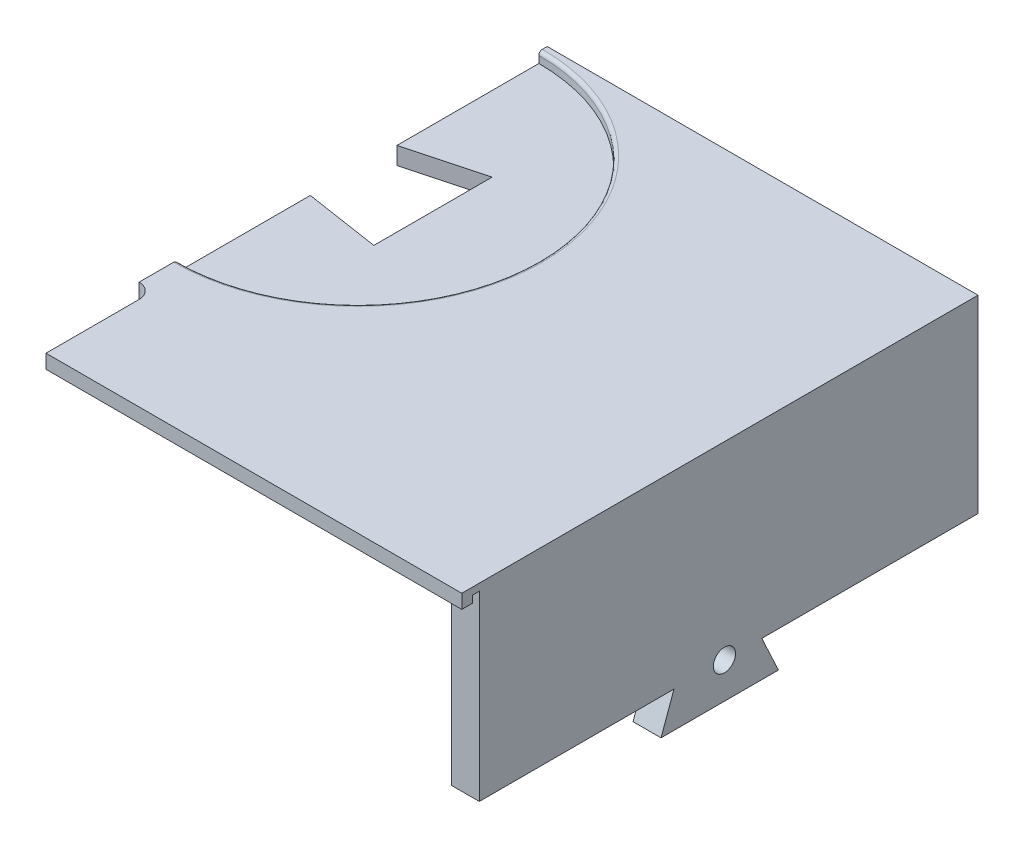
ISO-10303-21;
HEADER;
FILE_DESCRIPTION(('STEP AP214'),'2;1');
FILE_NAME('part.step','',(''),(''),'','','');
FILE_SCHEMA(('AUTOMOTIVE_DESIGN { 1 0 10303 214 1 1 1 1 }'));
ENDSEC;
DATA;
#1=APPLICATION_CONTEXT('core data for automotive mechanical design processes');
#2=APPLICATION_PROTOCOL_DEFINITION('international standard','automotive_design',2000,#1);
#3=PRODUCT_CONTEXT('',#1,'mechanical');
#4=PRODUCT('Part','Part','',(#3));
#5=PRODUCT_RELATED_PRODUCT_CATEGORY('part','',(#4));
#6=PRODUCT_DEFINITION_FORMATION('','',#4);
#7=PRODUCT_DEFINITION_CONTEXT('part definition',#1,'design');
#8=PRODUCT_DEFINITION('design','',#6,#7);
#9=PRODUCT_DEFINITION_SHAPE('','',#8);
#10=(LENGTH_UNIT() NAMED_UNIT(*) SI_UNIT(.MILLI.,.METRE.));
#11=(NAMED_UNIT(*) PLANE_ANGLE_UNIT() SI_UNIT($,.RADIAN.));
#12=(NAMED_UNIT(*) SI_UNIT($,.STERADIAN.) SOLID_ANGLE_UNIT());
#13=UNCERTAINTY_MEASURE_WITH_UNIT(LENGTH_MEASURE(1.E-05),#10,'distance_accuracy_value','');
#14=(GEOMETRIC_REPRESENTATION_CONTEXT(3) GLOBAL_UNCERTAINTY_ASSIGNED_CONTEXT((#13)) GLOBAL_UNIT_ASSIGNED_CONTEXT((#10,
#11,#12)) REPRESENTATION_CONTEXT('',''));
#15=CARTESIAN_POINT('',(0.,0.,0.));
#16=DIRECTION('',(0.,0.,1.));
#17=DIRECTION('',(1.,0.,0.));
#18=AXIS2_PLACEMENT_3D('',#15,#16,#17);
#19=CARTESIAN_POINT('',(-0.0100000000001627,-46.,90.919595482007));
#20=DIRECTION('',(0.,-1.,0.));
#21=DIRECTION('',(0.,0.,-1.));
#22=AXIS2_PLACEMENT_3D('',#19,#20,#21);
#23=PLANE('',#22);
#24=DIRECTION('',(0.,0.,1.));
#25=VECTOR('',#24,1.);
#26=CARTESIAN_POINT('',(115.,-46.,0.));
#27=LINE('',#26,#25);
#28=CARTESIAN_POINT('',(115.,-46.,14.4113737851326));
#29=VERTEX_POINT('',#28);
#30=CARTESIAN_POINT('',(115.,-46.,70.));
#31=VERTEX_POINT('',#30);
#32=EDGE_CURVE('E442',#29,#31,#27,.T.);
#33=ORIENTED_EDGE('',*,*,#32,.F.);
#34=DIRECTION('',(1.,0.,0.));
#35=VECTOR('',#34,1.);
#36=CARTESIAN_POINT('',(-0.0100000000001627,-46.,14.4113737851326));
#37=LINE('',#36,#35);
#38=CARTESIAN_POINT('',(123.,-46.,14.4113737851326));
#39=VERTEX_POINT('',#38);
#40=EDGE_CURVE('E11',#29,#39,#37,.T.);
#41=ORIENTED_EDGE('',*,*,#40,.T.);
#42=DIRECTION('',(0.,0.,1.));
#43=VECTOR('',#42,1.);
#44=CARTESIAN_POINT('',(123.,-46.,-313.));
#45=LINE('',#44,#43);
#46=CARTESIAN_POINT('',(123.,-46.,70.));
#47=VERTEX_POINT('',#46);
#48=EDGE_CURVE('E259',#39,#47,#45,.T.);
#49=ORIENTED_EDGE('',*,*,#48,.T.);
#50=DIRECTION('',(-1.,0.,0.));
#51=VECTOR('',#50,1.);
#52=CARTESIAN_POINT('',(123.,-46.,70.));
#53=LINE('',#52,#51);
#54=EDGE_CURVE('E251',#47,#31,#53,.T.);
#55=ORIENTED_EDGE('',*,*,#54,.T.);
#56=EDGE_LOOP('',(#33,#41,#49,#55));
#57=FACE_BOUND('',#56,.T.);
#58=ADVANCED_FACE('F34',(#57),#23,.T.);
#59=CARTESIAN_POINT('',(-0.0100000000001627,-46.,14.4113737851326));
#60=DIRECTION('',(0.,0.340441083604863,0.940265849956249));
#61=DIRECTION('',(0.,-0.940265849956249,0.340441083604863));
#62=AXIS2_PLACEMENT_3D('',#59,#60,#61);
#63=PLANE('',#62);
#64=DIRECTION('',(0.,0.940265849956249,-0.340441083604863));
#65=VECTOR('',#64,1.);
#66=CARTESIAN_POINT('',(115.,-0.718251440133874,-1.98374207275064));
#67=LINE('',#66,#65);
#68=CARTESIAN_POINT('',(115.,-56.2075124770156,18.1071972681901));
#69=VERTEX_POINT('',#68);
#70=EDGE_CURVE('E445',#69,#29,#67,.T.);
#71=ORIENTED_EDGE('',*,*,#70,.F.);
#72=DIRECTION('',(1.,0.,0.));
#73=VECTOR('',#72,1.);
#74=CARTESIAN_POINT('',(-0.0100000000001627,-56.2075124770156,18.1071972681901));
#75=LINE('',#74,#73);
#76=CARTESIAN_POINT('',(123.,-56.2075124770156,18.1071972681901));
#77=VERTEX_POINT('',#76);
#78=EDGE_CURVE('E43',#69,#77,#75,.T.);
#79=ORIENTED_EDGE('',*,*,#78,.T.);
#80=DIRECTION('',(0.,0.940265849956249,-0.340441083604863));
#81=VECTOR('',#80,1.);
#82=CARTESIAN_POINT('',(123.,106.547451582208,-40.8213242015313));
#83=LINE('',#82,#81);
#84=EDGE_CURVE('E262',#77,#39,#83,.T.);
#85=ORIENTED_EDGE('',*,*,#84,.T.);
#86=ORIENTED_EDGE('',*,*,#40,.F.);
#87=EDGE_LOOP('',(#71,#79,#85,#86));
#88=FACE_BOUND('',#87,.T.);
#89=ADVANCED_FACE('F469',(#88),#63,.T.);
#90=CARTESIAN_POINT('',(-0.0100000000001627,-56.2075124770156,18.1071972681901));
#91=DIRECTION('',(0.,-1.,0.));
#92=DIRECTION('',(0.,0.,-1.));
#93=AXIS2_PLACEMENT_3D('',#90,#91,#92);
#94=PLANE('',#93);
#95=DIRECTION('',(0.,0.,1.));
#96=VECTOR('',#95,1.);
#97=CARTESIAN_POINT('',(115.,-56.2075124770156,0.));
#98=LINE('',#97,#96);
#99=CARTESIAN_POINT('',(115.,-56.2075124770156,-15.4192014709746));
#100=VERTEX_POINT('',#99);
#101=EDGE_CURVE('E448',#100,#69,#98,.T.);
#102=ORIENTED_EDGE('',*,*,#101,.F.);
#103=DIRECTION('',(1.,0.,0.));
#104=VECTOR('',#103,1.);
#105=CARTESIAN_POINT('',(-0.0100000000001627,-56.2075124770156,-15.4192014709746));
#106=LINE('',#105,#104);
#107=CARTESIAN_POINT('',(123.,-56.2075124770156,-15.4192014709746));
#108=VERTEX_POINT('',#107);
#109=EDGE_CURVE('E438',#100,#108,#106,.T.);
#110=ORIENTED_EDGE('',*,*,#109,.T.);
#111=DIRECTION('',(0.,0.,1.));
#112=VECTOR('',#111,1.);
#113=CARTESIAN_POINT('',(123.,-56.2075124770156,-313.));
#114=LINE('',#113,#112);
#115=EDGE_CURVE('E463',#108,#77,#114,.T.);
#116=ORIENTED_EDGE('',*,*,#115,.T.);
#117=ORIENTED_EDGE('',*,*,#78,.F.);
#118=EDGE_LOOP('',(#102,#110,#116,#117));
#119=FACE_BOUND('',#118,.T.);
#120=ADVANCED_FACE('F474',(#119),#94,.T.);
#121=CARTESIAN_POINT('',(-0.0100000000001627,-46.,-10.6674284213292));
#122=DIRECTION('',(0.,-1.,0.));
#123=DIRECTION('',(0.,0.,-1.));
#124=AXIS2_PLACEMENT_3D('',#121,#122,#123);
#125=PLANE('',#124);
#126=DIRECTION('',(0.,0.,1.));
#127=VECTOR('',#126,1.);
#128=CARTESIAN_POINT('',(115.,-46.,0.));
#129=LINE('',#128,#127);
#130=CARTESIAN_POINT('',(115.,-46.,-67.));
#131=VERTEX_POINT('',#130);
#132=CARTESIAN_POINT('',(115.,-46.,-10.6674284213292));
#133=VERTEX_POINT('',#132);
#134=EDGE_CURVE('E454',#131,#133,#129,.T.);
#135=ORIENTED_EDGE('',*,*,#134,.F.);
#136=DIRECTION('',(-1.,0.,0.));
#137=VECTOR('',#136,1.);
#138=CARTESIAN_POINT('',(-125.,-46.,-67.));
#139=LINE('',#138,#137);
#140=CARTESIAN_POINT('',(0.,-46.,-67.));
#141=VERTEX_POINT('',#140);
#142=EDGE_CURVE('E458',#131,#141,#139,.T.);
#143=ORIENTED_EDGE('',*,*,#142,.T.);
#144=DIRECTION('',(0.,0.,1.));
#145=VECTOR('',#144,1.);
#146=CARTESIAN_POINT('',(0.,-46.,-81.3471847648053));
#147=LINE('',#146,#145);
#148=CARTESIAN_POINT('',(0.,-46.,-72.4000000000001));
#149=VERTEX_POINT('',#148);
#150=EDGE_CURVE('E258',#149,#141,#147,.T.);
#151=ORIENTED_EDGE('',*,*,#150,.F.);
#152=DIRECTION('',(1.,0.,0.));
#153=VECTOR('',#152,1.);
#154=CARTESIAN_POINT('',(-265.,-46.,-72.4000000000001));
#155=LINE('',#154,#153);
#156=CARTESIAN_POINT('',(123.,-46.,-72.4000000000001));
#157=VERTEX_POINT('',#156);
#158=EDGE_CURVE('E237',#149,#157,#155,.T.);
#159=ORIENTED_EDGE('',*,*,#158,.T.);
#160=DIRECTION('',(0.,0.,1.));
#161=VECTOR('',#160,1.);
#162=CARTESIAN_POINT('',(123.,-46.,-313.));
#163=LINE('',#162,#161);
#164=CARTESIAN_POINT('',(123.,-46.,-10.6674284213292));
#165=VERTEX_POINT('',#164);
#166=EDGE_CURVE('E245',#157,#165,#163,.T.);
#167=ORIENTED_EDGE('',*,*,#166,.T.);
#168=DIRECTION('',(1.,0.,0.));
#169=VECTOR('',#168,1.);
#170=CARTESIAN_POINT('',(-0.0100000000001627,-46.,-10.6674284213292));
#171=LINE('',#170,#169);
#172=EDGE_CURVE('E440',#133,#165,#171,.T.);
#173=ORIENTED_EDGE('',*,*,#172,.F.);
#174=EDGE_LOOP('',(#135,#143,#151,#159,#167,#173));
#175=FACE_BOUND('',#174,.T.);
#176=ADVANCED_FACE('F255',(#175),#125,.T.);
#177=CARTESIAN_POINT('',(-0.0100000000001627,-56.2075124770156,-15.4192014709746));
#178=DIRECTION('',(0.,0.422029580157873,-0.906582061079839));
#179=DIRECTION('',(0.,0.906582061079839,0.422029580157873));
#180=AXIS2_PLACEMENT_3D('',#177,#178,#179);
#181=PLANE('',#180);
#182=DIRECTION('',(0.,-0.906582061079839,-0.422029580157873));
#183=VECTOR('',#182,1.);
#184=CARTESIAN_POINT('',(115.,-4.11160691233821,8.83234077465208));
#185=LINE('',#184,#183);
#186=EDGE_CURVE('E451',#133,#100,#185,.T.);
#187=ORIENTED_EDGE('',*,*,#186,.F.);
#188=ORIENTED_EDGE('',*,*,#172,.T.);
#189=DIRECTION('',(0.,-0.906582061079839,-0.422029580157873));
#190=VECTOR('',#189,1.);
#191=CARTESIAN_POINT('',(123.,-117.29167043543,-43.8549301757546));
#192=LINE('',#191,#190);
#193=EDGE_CURVE('E249',#165,#108,#192,.T.);
#194=ORIENTED_EDGE('',*,*,#193,.T.);
#195=ORIENTED_EDGE('',*,*,#109,.F.);
#196=EDGE_LOOP('',(#187,#188,#194,#195));
#197=FACE_BOUND('',#196,.T.);
#198=ADVANCED_FACE('F477',(#197),#181,.T.);
#199=CARTESIAN_POINT('',(0.,-100.01,-81.3471847648053));
#200=DIRECTION('',(-1.,0.,0.));
#201=DIRECTION('',(0.,0.,1.));
#202=AXIS2_PLACEMENT_3D('',#199,#200,#201);
#203=PLANE('',#202);
#204=DIRECTION('',(0.,-1.,0.));
#205=VECTOR('',#204,1.);
#206=CARTESIAN_POINT('',(0.,8.,-72.4000000000001));
#207=LINE('',#206,#205);
#208=CARTESIAN_POINT('',(0.,-39.5,-72.4000000000001));
#209=VERTEX_POINT('',#208);
#210=EDGE_CURVE('E38',#209,#149,#207,.T.);
#211=ORIENTED_EDGE('',*,*,#210,.T.);
#212=ORIENTED_EDGE('',*,*,#150,.T.);
#213=DIRECTION('',(0.,1.,0.));
#214=VECTOR('',#213,1.);
#215=CARTESIAN_POINT('',(0.,-100.,-67.));
#216=LINE('',#215,#214);
#217=CARTESIAN_POINT('',(0.,0.,-67.));
#218=VERTEX_POINT('',#217);
#219=EDGE_CURVE('E285',#141,#218,#216,.T.);
#220=ORIENTED_EDGE('',*,*,#219,.T.);
#221=DIRECTION('',(0.,0.,1.));
#222=VECTOR('',#221,1.);
#223=CARTESIAN_POINT('',(0.,0.,0.));
#224=LINE('',#223,#222);
#225=CARTESIAN_POINT('',(0.,0.,-29.4930279764145));
#226=VERTEX_POINT('',#225);
#227=EDGE_CURVE('E315',#218,#226,#224,.T.);
#228=ORIENTED_EDGE('',*,*,#227,.T.);
#229=DIRECTION('',(0.,1.,0.));
#230=VECTOR('',#229,1.);
#231=CARTESIAN_POINT('',(0.,-100.01,-29.4930279764145));
#232=LINE('',#231,#230);
#233=CARTESIAN_POINT('',(0.,5.,-29.4930279764145));
#234=VERTEX_POINT('',#233);
#235=EDGE_CURVE('E269',#226,#234,#232,.T.);
#236=ORIENTED_EDGE('',*,*,#235,.T.);
#237=DIRECTION('',(0.,0.,1.));
#238=VECTOR('',#237,1.);
#239=CARTESIAN_POINT('',(0.,5.,-18.35));
#240=LINE('',#239,#238);
#241=CARTESIAN_POINT('',(0.,5.,-70.));
#242=VERTEX_POINT('',#241);
#243=EDGE_CURVE('E498',#242,#234,#240,.T.);
#244=ORIENTED_EDGE('',*,*,#243,.F.);
#245=DIRECTION('',(0.,1.,0.));
#246=VECTOR('',#245,1.);
#247=CARTESIAN_POINT('',(0.,5.,-70.));
#248=LINE('',#247,#246);
#249=CARTESIAN_POINT('',(0.,7.,-70.));
#250=VERTEX_POINT('',#249);
#251=EDGE_CURVE('E320',#242,#250,#248,.T.);
#252=ORIENTED_EDGE('',*,*,#251,.T.);
#253=CARTESIAN_POINT('',(0.,7.,-71.));
#254=DIRECTION('',(-1.,0.,0.));
#255=DIRECTION('',(0.,0.,1.));
#256=AXIS2_PLACEMENT_3D('',#253,#254,#255);
#257=CIRCLE('',#256,1.);
#258=CARTESIAN_POINT('',(0.,8.,-71.));
#259=VERTEX_POINT('',#258);
#260=EDGE_CURVE('E489',#259,#250,#257,.F.);
#261=ORIENTED_EDGE('',*,*,#260,.F.);
#262=DIRECTION('',(0.,0.,1.));
#263=VECTOR('',#262,1.);
#264=CARTESIAN_POINT('',(0.,8.,0.));
#265=LINE('',#264,#263);
#266=CARTESIAN_POINT('',(-1.66533453693773E-13,8.,-72.4000000000001));
#267=VERTEX_POINT('',#266);
#268=EDGE_CURVE('E295',#267,#259,#265,.T.);
#269=ORIENTED_EDGE('',*,*,#268,.F.);
#270=CARTESIAN_POINT('',(0.,-14.5,-72.4000000000001));
#271=VERTEX_POINT('',#270);
#272=EDGE_CURVE('E327',#267,#271,#207,.T.);
#273=ORIENTED_EDGE('',*,*,#272,.T.);
#274=DIRECTION('',(0.,0.,-1.));
#275=VECTOR('',#274,1.);
#276=CARTESIAN_POINT('',(0.,-14.5,-69.));
#277=LINE('',#276,#275);
#278=CARTESIAN_POINT('',(0.,-14.5,-69.));
#279=VERTEX_POINT('',#278);
#280=EDGE_CURVE('E488',#279,#271,#277,.T.);
#281=ORIENTED_EDGE('',*,*,#280,.F.);
#282=DIRECTION('',(0.,1.,0.));
#283=VECTOR('',#282,1.);
#284=CARTESIAN_POINT('',(0.,0.,-69.));
#285=LINE('',#284,#283);
#286=CARTESIAN_POINT('',(0.,-39.5,-69.));
#287=VERTEX_POINT('',#286);
#288=EDGE_CURVE('E432',#287,#279,#285,.T.);
#289=ORIENTED_EDGE('',*,*,#288,.F.);
#290=DIRECTION('',(0.,0.,-1.));
#291=VECTOR('',#290,1.);
#292=CARTESIAN_POINT('',(0.,-39.5,-69.));
#293=LINE('',#292,#291);
#294=EDGE_CURVE('E325',#287,#209,#293,.T.);
#295=ORIENTED_EDGE('',*,*,#294,.T.);
#296=EDGE_LOOP('',(#211,#212,#220,#228,#236,#244,#252,#261,#269,#273,#281,#289,#295));
#297=FACE_BOUND('',#296,.T.);
#298=ADVANCED_FACE('F484',(#297),#203,.T.);
#299=CARTESIAN_POINT('',(115.,0.,0.));
#300=DIRECTION('',(-1.,0.,0.));
#301=DIRECTION('',(0.,0.,1.));
#302=AXIS2_PLACEMENT_3D('',#299,#300,#301);
#303=PLANE('',#302);
#304=CARTESIAN_POINT('',(115.,-46.,0.));
#305=DIRECTION('',(-1.,0.,0.));
#306=DIRECTION('',(0.,0.,1.));
#307=AXIS2_PLACEMENT_3D('',#304,#305,#306);
#308=CIRCLE('',#307,3.175);
#309=CARTESIAN_POINT('',(115.,-46.,3.175));
#310=VERTEX_POINT('',#309);
#311=EDGE_CURVE('E284',#310,#310,#308,.T.);
#312=ORIENTED_EDGE('',*,*,#311,.F.);
#313=EDGE_LOOP('',(#312));
#314=FACE_BOUND('',#313,.T.);
#315=DIRECTION('',(0.,1.,0.));
#316=VECTOR('',#315,1.);
#317=CARTESIAN_POINT('',(115.,-100.,-67.));
#318=LINE('',#317,#316);
#319=CARTESIAN_POINT('',(115.,0.,-67.));
#320=VERTEX_POINT('',#319);
#321=EDGE_CURVE('E282',#131,#320,#318,.T.);
#322=ORIENTED_EDGE('',*,*,#321,.F.);
#323=ORIENTED_EDGE('',*,*,#134,.T.);
#324=ORIENTED_EDGE('',*,*,#186,.T.);
#325=ORIENTED_EDGE('',*,*,#101,.T.);
#326=ORIENTED_EDGE('',*,*,#70,.T.);
#327=ORIENTED_EDGE('',*,*,#32,.T.);
#328=DIRECTION('',(0.,-1.,0.));
#329=VECTOR('',#328,1.);
#330=CARTESIAN_POINT('',(115.,0.,70.));
#331=LINE('',#330,#329);
#332=CARTESIAN_POINT('',(115.,0.,70.));
#333=VERTEX_POINT('',#332);
#334=EDGE_CURVE('E274',#333,#31,#331,.T.);
#335=ORIENTED_EDGE('',*,*,#334,.F.);
#336=DIRECTION('',(0.,0.,1.));
#337=VECTOR('',#336,1.);
#338=CARTESIAN_POINT('',(115.,0.,0.));
#339=LINE('',#338,#337);
#340=EDGE_CURVE('E283',#320,#333,#339,.T.);
#341=ORIENTED_EDGE('',*,*,#340,.F.);
#342=EDGE_LOOP('',(#322,#323,#324,#325,#326,#327,#335,#341));
#343=FACE_BOUND('',#342,.T.);
#344=ADVANCED_FACE('F529',(#314,#343),#303,.T.);
#345=CARTESIAN_POINT('',(-125.,-100.,-67.));
#346=DIRECTION('',(0.,0.,-1.));
#347=DIRECTION('',(-1.,0.,0.));
#348=AXIS2_PLACEMENT_3D('',#345,#346,#347);
#349=PLANE('',#348);
#350=DIRECTION('',(-1.,0.,0.));
#351=VECTOR('',#350,1.);
#352=CARTESIAN_POINT('',(-125.,-39.4999999999999,-67.));
#353=LINE('',#352,#351);
#354=CARTESIAN_POINT('',(76.9999999999999,-39.5,-67.));
#355=VERTEX_POINT('',#354);
#356=CARTESIAN_POINT('',(53.9999999999999,-39.5,-67.));
#357=VERTEX_POINT('',#356);
#358=EDGE_CURVE('E413',#355,#357,#353,.T.);
#359=ORIENTED_EDGE('',*,*,#358,.T.);
#360=DIRECTION('',(0.,1.,0.));
#361=VECTOR('',#360,1.);
#362=CARTESIAN_POINT('',(53.9999999999999,-100.,-67.));
#363=LINE('',#362,#361);
#364=CARTESIAN_POINT('',(53.9999999999999,-14.5,-67.));
#365=VERTEX_POINT('',#364);
#366=EDGE_CURVE('E400',#357,#365,#363,.T.);
#367=ORIENTED_EDGE('',*,*,#366,.T.);
#368=DIRECTION('',(1.,0.,0.));
#369=VECTOR('',#368,1.);
#370=CARTESIAN_POINT('',(-125.,-14.5,-67.));
#371=LINE('',#370,#369);
#372=CARTESIAN_POINT('',(76.9999999999999,-14.5,-67.));
#373=VERTEX_POINT('',#372);
#374=EDGE_CURVE('E410',#365,#373,#371,.T.);
#375=ORIENTED_EDGE('',*,*,#374,.T.);
#376=DIRECTION('',(0.,-1.,0.));
#377=VECTOR('',#376,1.);
#378=CARTESIAN_POINT('',(76.9999999999999,-100.,-67.));
#379=LINE('',#378,#377);
#380=EDGE_CURVE('E330',#373,#355,#379,.T.);
#381=ORIENTED_EDGE('',*,*,#380,.T.);
#382=EDGE_LOOP('',(#359,#367,#375,#381));
#383=FACE_BOUND('',#382,.T.);
#384=CARTESIAN_POINT('',(25.005,-27.,-67.));
#385=DIRECTION('',(0.,0.,-1.));
#386=DIRECTION('',(-1.,0.,0.));
#387=AXIS2_PLACEMENT_3D('',#384,#385,#386);
#388=CIRCLE('',#387,1.5);
#389=CARTESIAN_POINT('',(23.505,-27.,-67.));
#390=VERTEX_POINT('',#389);
#391=EDGE_CURVE('E355',#390,#390,#388,.T.);
#392=ORIENTED_EDGE('',*,*,#391,.T.);
#393=EDGE_LOOP('',(#392));
#394=FACE_BOUND('',#393,.T.);
#395=ORIENTED_EDGE('',*,*,#142,.F.);
#396=ORIENTED_EDGE('',*,*,#321,.T.);
#397=DIRECTION('',(-1.,0.,0.));
#398=VECTOR('',#397,1.);
#399=CARTESIAN_POINT('',(-125.,0.,-67.));
#400=LINE('',#399,#398);
#401=EDGE_CURVE('E346',#320,#218,#400,.T.);
#402=ORIENTED_EDGE('',*,*,#401,.T.);
#403=ORIENTED_EDGE('',*,*,#219,.F.);
#404=EDGE_LOOP('',(#395,#396,#402,#403));
#405=FACE_BOUND('',#404,.T.);
#406=ADVANCED_FACE('F481',(#383,#394,#405),#349,.F.);
#407=CARTESIAN_POINT('',(123.,0.,70.));
#408=DIRECTION('',(0.,0.,-1.));
#409=DIRECTION('',(0.,1.,0.));
#410=AXIS2_PLACEMENT_3D('',#407,#408,#409);
#411=PLANE('',#410);
#412=ORIENTED_EDGE('',*,*,#54,.F.);
#413=DIRECTION('',(0.,-1.,0.));
#414=VECTOR('',#413,1.);
#415=CARTESIAN_POINT('',(123.,0.,70.));
#416=LINE('',#415,#414);
#417=CARTESIAN_POINT('',(123.,6.00000000000003,70.));
#418=VERTEX_POINT('',#417);
#419=EDGE_CURVE('E270',#418,#47,#416,.T.);
#420=ORIENTED_EDGE('',*,*,#419,.F.);
#421=DIRECTION('',(-1.,0.,0.));
#422=VECTOR('',#421,1.);
#423=CARTESIAN_POINT('',(123.,6.00000000000003,70.));
#424=LINE('',#423,#422);
#425=CARTESIAN_POINT('',(4.2757999717635,6.00000000000002,70.));
#426=VERTEX_POINT('',#425);
#427=EDGE_CURVE('E362',#418,#426,#424,.T.);
#428=ORIENTED_EDGE('',*,*,#427,.T.);
#429=DIRECTION('',(0.,1.,0.));
#430=VECTOR('',#429,1.);
#431=CARTESIAN_POINT('',(4.2757999717635,0.,70.));
#432=LINE('',#431,#430);
#433=CARTESIAN_POINT('',(4.27579997176349,0.,70.));
#434=VERTEX_POINT('',#433);
#435=EDGE_CURVE('E241',#434,#426,#432,.T.);
#436=ORIENTED_EDGE('',*,*,#435,.F.);
#437=DIRECTION('',(-1.,0.,0.));
#438=VECTOR('',#437,1.);
#439=CARTESIAN_POINT('',(0.,0.,70.));
#440=LINE('',#439,#438);
#441=EDGE_CURVE('E275',#333,#434,#440,.T.);
#442=ORIENTED_EDGE('',*,*,#441,.F.);
#443=ORIENTED_EDGE('',*,*,#334,.T.);
#444=EDGE_LOOP('',(#412,#420,#428,#436,#442,#443));
#445=FACE_BOUND('',#444,.T.);
#446=ADVANCED_FACE('F526',(#445),#411,.F.);
#447=CARTESIAN_POINT('',(123.,8.,-313.));
#448=DIRECTION('',(-1.,0.,0.));
#449=DIRECTION('',(0.,0.,1.));
#450=AXIS2_PLACEMENT_3D('',#447,#448,#449);
#451=PLANE('',#450);
#452=CARTESIAN_POINT('',(123.,-46.,0.));
#453=DIRECTION('',(-1.,0.,0.));
#454=DIRECTION('',(0.,0.,1.));
#455=AXIS2_PLACEMENT_3D('',#452,#453,#454);
#456=CIRCLE('',#455,3.175);
#457=CARTESIAN_POINT('',(123.,-46.,3.175));
#458=VERTEX_POINT('',#457);
#459=EDGE_CURVE('E394',#458,#458,#456,.F.);
#460=ORIENTED_EDGE('',*,*,#459,.F.);
#461=EDGE_LOOP('',(#460));
#462=FACE_BOUND('',#461,.T.);
#463=ORIENTED_EDGE('',*,*,#166,.F.);
#464=DIRECTION('',(0.,-1.,0.));
#465=VECTOR('',#464,1.);
#466=CARTESIAN_POINT('',(123.,8.,-72.4000000000001));
#467=LINE('',#466,#465);
#468=CARTESIAN_POINT('',(123.,8.,-72.4000000000001));
#469=VERTEX_POINT('',#468);
#470=EDGE_CURVE('E233',#469,#157,#467,.T.);
#471=ORIENTED_EDGE('',*,*,#470,.F.);
#472=DIRECTION('',(0.,0.,1.));
#473=VECTOR('',#472,1.);
#474=CARTESIAN_POINT('',(123.,8.,-313.));
#475=LINE('',#474,#473);
#476=CARTESIAN_POINT('',(123.,8.,75.));
#477=VERTEX_POINT('',#476);
#478=EDGE_CURVE('E281',#469,#477,#475,.T.);
#479=ORIENTED_EDGE('',*,*,#478,.T.);
#480=DIRECTION('',(0.,-1.,0.));
#481=VECTOR('',#480,1.);
#482=CARTESIAN_POINT('',(123.,8.,75.));
#483=LINE('',#482,#481);
#484=CARTESIAN_POINT('',(123.,4.00000000000003,75.));
#485=VERTEX_POINT('',#484);
#486=EDGE_CURVE('E278',#477,#485,#483,.T.);
#487=ORIENTED_EDGE('',*,*,#486,.T.);
#488=DIRECTION('',(0.,0.,-1.));
#489=VECTOR('',#488,1.);
#490=CARTESIAN_POINT('',(123.,4.00000000000001,0.));
#491=LINE('',#490,#489);
#492=CARTESIAN_POINT('',(123.,4.00000000000003,72.));
#493=VERTEX_POINT('',#492);
#494=EDGE_CURVE('E373',#485,#493,#491,.T.);
#495=ORIENTED_EDGE('',*,*,#494,.T.);
#496=DIRECTION('',(0.,1.,0.));
#497=VECTOR('',#496,1.);
#498=CARTESIAN_POINT('',(123.,0.,72.));
#499=LINE('',#498,#497);
#500=CARTESIAN_POINT('',(123.,6.00000000000003,72.));
#501=VERTEX_POINT('',#500);
#502=EDGE_CURVE('E376',#493,#501,#499,.T.);
#503=ORIENTED_EDGE('',*,*,#502,.T.);
#504=DIRECTION('',(0.,0.,-1.));
#505=VECTOR('',#504,1.);
#506=CARTESIAN_POINT('',(123.,6.00000000000003,0.));
#507=LINE('',#506,#505);
#508=EDGE_CURVE('E273',#501,#418,#507,.T.);
#509=ORIENTED_EDGE('',*,*,#508,.T.);
#510=ORIENTED_EDGE('',*,*,#419,.T.);
#511=ORIENTED_EDGE('',*,*,#48,.F.);
#512=ORIENTED_EDGE('',*,*,#84,.F.);
#513=ORIENTED_EDGE('',*,*,#115,.F.);
#514=ORIENTED_EDGE('',*,*,#193,.F.);
#515=EDGE_LOOP('',(#463,#471,#479,#487,#495,#503,#509,#510,#511,#512,#513,#514));
#516=FACE_BOUND('',#515,.T.);
#517=ADVANCED_FACE('F246',(#462,#516),#451,.F.);
#518=CARTESIAN_POINT('',(-265.,8.,-72.4000000000001));
#519=DIRECTION('',(0.,0.,1.));
#520=DIRECTION('',(0.,-1.,0.));
#521=AXIS2_PLACEMENT_3D('',#518,#519,#520);
#522=PLANE('',#521);
#523=ORIENTED_EDGE('',*,*,#158,.F.);
#524=ORIENTED_EDGE('',*,*,#210,.F.);
#525=DIRECTION('',(-1.,0.,0.));
#526=VECTOR('',#525,1.);
#527=CARTESIAN_POINT('',(0.,-39.5,-72.4000000000001));
#528=LINE('',#527,#526);
#529=CARTESIAN_POINT('',(76.9999999999999,-39.5,-72.4000000000001));
#530=VERTEX_POINT('',#529);
#531=EDGE_CURVE('E51',#530,#209,#528,.T.);
#532=ORIENTED_EDGE('',*,*,#531,.F.);
#533=DIRECTION('',(0.,-1.,0.));
#534=VECTOR('',#533,1.);
#535=CARTESIAN_POINT('',(76.9999999999999,-14.5,-72.4000000000001));
#536=LINE('',#535,#534);
#537=CARTESIAN_POINT('',(76.9999999999999,-14.5,-72.4000000000001));
#538=VERTEX_POINT('',#537);
#539=EDGE_CURVE('E358',#538,#530,#536,.T.);
#540=ORIENTED_EDGE('',*,*,#539,.F.);
#541=DIRECTION('',(-1.,0.,0.));
#542=VECTOR('',#541,1.);
#543=CARTESIAN_POINT('',(0.,-14.5,-72.4000000000001));
#544=LINE('',#543,#542);
#545=EDGE_CURVE('E59',#538,#271,#544,.T.);
#546=ORIENTED_EDGE('',*,*,#545,.T.);
#547=ORIENTED_EDGE('',*,*,#272,.F.);
#548=DIRECTION('',(1.,0.,0.));
#549=VECTOR('',#548,1.);
#550=CARTESIAN_POINT('',(-265.,8.,-72.4000000000001));
#551=LINE('',#550,#549);
#552=EDGE_CURVE('E238',#267,#469,#551,.T.);
#553=ORIENTED_EDGE('',*,*,#552,.T.);
#554=ORIENTED_EDGE('',*,*,#470,.T.);
#555=EDGE_LOOP('',(#523,#524,#532,#540,#546,#547,#553,#554));
#556=FACE_BOUND('',#555,.T.);
#557=ADVANCED_FACE('F36',(#556),#522,.F.);
#558=CARTESIAN_POINT('',(21.4254854809113,-100.01,-35.2331156649871));
#559=DIRECTION('',(0.258783129312768,0.,0.965935449180271));
#560=DIRECTION('',(0.965935449180271,0.,-0.258783129312768));
#561=AXIS2_PLACEMENT_3D('',#558,#559,#560);
#562=PLANE('',#561);
#563=ORIENTED_EDGE('',*,*,#235,.F.);
#564=DIRECTION('',(0.965935449180271,0.,-0.258783129312768));
#565=VECTOR('',#564,1.);
#566=CARTESIAN_POINT('',(-7.3723072670786,0.,-27.5179179973275));
#567=LINE('',#566,#565);
#568=CARTESIAN_POINT('',(21.4254854809113,0.,-35.2331156649871));
#569=VERTEX_POINT('',#568);
#570=EDGE_CURVE('E312',#226,#569,#567,.T.);
#571=ORIENTED_EDGE('',*,*,#570,.T.);
#572=DIRECTION('',(0.,1.,0.));
#573=VECTOR('',#572,1.);
#574=CARTESIAN_POINT('',(21.4254854809113,-100.01,-35.2331156649871));
#575=LINE('',#574,#573);
#576=CARTESIAN_POINT('',(21.4254854809113,5.,-35.2331156649871));
#577=VERTEX_POINT('',#576);
#578=EDGE_CURVE('E266',#569,#577,#575,.T.);
#579=ORIENTED_EDGE('',*,*,#578,.T.);
#580=DIRECTION('',(0.965935449180271,0.,-0.258783129312768));
#581=VECTOR('',#580,1.);
#582=CARTESIAN_POINT('',(-2.78539816913595,5.,-28.7467937894378));
#583=LINE('',#582,#581);
#584=EDGE_CURVE('E617',#234,#577,#583,.T.);
#585=ORIENTED_EDGE('',*,*,#584,.F.);
#586=EDGE_LOOP('',(#563,#571,#579,#585));
#587=FACE_BOUND('',#586,.T.);
#588=ADVANCED_FACE('F552',(#587),#562,.T.);
#589=CARTESIAN_POINT('',(21.4254854809113,-100.01,-35.2331156649871));
#590=DIRECTION('',(-1.,0.,0.));
#591=DIRECTION('',(0.,0.,1.));
#592=AXIS2_PLACEMENT_3D('',#589,#590,#591);
#593=PLANE('',#592);
#594=ORIENTED_EDGE('',*,*,#578,.F.);
#595=DIRECTION('',(0.,0.,1.));
#596=VECTOR('',#595,1.);
#597=CARTESIAN_POINT('',(21.4254854809113,0.,0.));
#598=LINE('',#597,#596);
#599=CARTESIAN_POINT('',(21.4254854809113,0.,-1.46688433501296));
#600=VERTEX_POINT('',#599);
#601=EDGE_CURVE('E309',#569,#600,#598,.T.);
#602=ORIENTED_EDGE('',*,*,#601,.T.);
#603=DIRECTION('',(0.,1.,0.));
#604=VECTOR('',#603,1.);
#605=CARTESIAN_POINT('',(21.4254854809113,-100.01,-1.46688433501296));
#606=LINE('',#605,#604);
#607=CARTESIAN_POINT('',(21.4254854809113,5.,-1.46688433501296));
#608=VERTEX_POINT('',#607);
#609=EDGE_CURVE('E268',#600,#608,#606,.T.);
#610=ORIENTED_EDGE('',*,*,#609,.T.);
#611=DIRECTION('',(0.,0.,1.));
#612=VECTOR('',#611,1.);
#613=CARTESIAN_POINT('',(21.4254854809113,5.,-18.35));
#614=LINE('',#613,#612);
#615=EDGE_CURVE('E624',#577,#608,#614,.T.);
#616=ORIENTED_EDGE('',*,*,#615,.F.);
#617=EDGE_LOOP('',(#594,#602,#610,#616));
#618=FACE_BOUND('',#617,.T.);
#619=ADVANCED_FACE('F543',(#618),#593,.T.);
#620=CARTESIAN_POINT('',(0.,-100.01,-4.74420413741328));
#621=DIRECTION('',(-1.,0.,0.));
#622=DIRECTION('',(0.,0.,1.));
#623=AXIS2_PLACEMENT_3D('',#620,#621,#622);
#624=PLANE('',#623);
#625=DIRECTION('',(0.,1.,0.));
#626=VECTOR('',#625,1.);
#627=CARTESIAN_POINT('',(0.,-100.01,-4.74420413741328));
#628=LINE('',#627,#626);
#629=CARTESIAN_POINT('',(0.,0.,-4.74420413741328));
#630=VERTEX_POINT('',#629);
#631=CARTESIAN_POINT('',(0.,5.,-4.74420413741328));
#632=VERTEX_POINT('',#631);
#633=EDGE_CURVE('E377',#630,#632,#628,.T.);
#634=ORIENTED_EDGE('',*,*,#633,.F.);
#635=DIRECTION('',(0.,0.,1.));
#636=VECTOR('',#635,1.);
#637=CARTESIAN_POINT('',(0.,0.,0.));
#638=LINE('',#637,#636);
#639=CARTESIAN_POINT('',(0.,0.,44.1469138090141));
#640=VERTEX_POINT('',#639);
#641=EDGE_CURVE('E286',#630,#640,#638,.T.);
#642=ORIENTED_EDGE('',*,*,#641,.T.);
#643=DIRECTION('',(0.,1.,0.));
#644=VECTOR('',#643,1.);
#645=CARTESIAN_POINT('',(0.,0.,44.1469138090141));
#646=LINE('',#645,#644);
#647=CARTESIAN_POINT('',(0.,8.,44.1469138090141));
#648=VERTEX_POINT('',#647);
#649=EDGE_CURVE('E323',#640,#648,#646,.T.);
#650=ORIENTED_EDGE('',*,*,#649,.T.);
#651=DIRECTION('',(0.,0.,1.));
#652=VECTOR('',#651,1.);
#653=CARTESIAN_POINT('',(0.,8.,0.));
#654=LINE('',#653,#652);
#655=CARTESIAN_POINT('',(0.,8.,34.3));
#656=VERTEX_POINT('',#655);
#657=EDGE_CURVE('E287',#656,#648,#654,.T.);
#658=ORIENTED_EDGE('',*,*,#657,.F.);
#659=CARTESIAN_POINT('',(0.,7.,34.3));
#660=DIRECTION('',(-1.,0.,0.));
#661=DIRECTION('',(0.,0.,1.));
#662=AXIS2_PLACEMENT_3D('',#659,#660,#661);
#663=CIRCLE('',#662,1.);
#664=CARTESIAN_POINT('',(0.,7.,33.3));
#665=VERTEX_POINT('',#664);
#666=EDGE_CURVE('E495',#665,#656,#663,.F.);
#667=ORIENTED_EDGE('',*,*,#666,.F.);
#668=DIRECTION('',(0.,1.,0.));
#669=VECTOR('',#668,1.);
#670=CARTESIAN_POINT('',(0.,5.,33.3));
#671=LINE('',#670,#669);
#672=CARTESIAN_POINT('',(0.,5.,33.3));
#673=VERTEX_POINT('',#672);
#674=EDGE_CURVE('E317',#665,#673,#671,.F.);
#675=ORIENTED_EDGE('',*,*,#674,.T.);
#676=DIRECTION('',(0.,0.,1.));
#677=VECTOR('',#676,1.);
#678=CARTESIAN_POINT('',(0.,5.,-18.35));
#679=LINE('',#678,#677);
#680=EDGE_CURVE('E303',#632,#673,#679,.T.);
#681=ORIENTED_EDGE('',*,*,#680,.F.);
#682=EDGE_LOOP('',(#634,#642,#650,#658,#667,#675,#681));
#683=FACE_BOUND('',#682,.T.);
#684=ADVANCED_FACE('F500',(#683),#624,.T.);
#685=CARTESIAN_POINT('',(21.4254854809113,-100.01,-1.46688433501296));
#686=DIRECTION('',(0.151204910896183,0.,-0.988502440523481));
#687=DIRECTION('',(-0.988502440523481,0.,-0.151204910896183));
#688=AXIS2_PLACEMENT_3D('',#685,#686,#687);
#689=PLANE('',#688);
#690=ORIENTED_EDGE('',*,*,#609,.F.);
#691=DIRECTION('',(-0.988502440523481,0.,-0.151204910896183));
#692=VECTOR('',#691,1.);
#693=CARTESIAN_POINT('',(0.709099224488469,0.,-4.63573775365953));
#694=LINE('',#693,#692);
#695=EDGE_CURVE('E292',#600,#630,#694,.T.);
#696=ORIENTED_EDGE('',*,*,#695,.T.);
#697=ORIENTED_EDGE('',*,*,#633,.T.);
#698=DIRECTION('',(-0.988502440523481,0.,-0.151204910896183));
#699=VECTOR('',#698,1.);
#700=CARTESIAN_POINT('',(-2.03360964563575,5.,-5.05527242886143));
#701=LINE('',#700,#699);
#702=EDGE_CURVE('E629',#608,#632,#701,.T.);
#703=ORIENTED_EDGE('',*,*,#702,.F.);
#704=EDGE_LOOP('',(#690,#696,#697,#703));
#705=FACE_BOUND('',#704,.T.);
#706=ADVANCED_FACE('F574',(#705),#689,.T.);
#707=CARTESIAN_POINT('',(123.,6.00000000000003,0.));
#708=DIRECTION('',(0.,1.,0.));
#709=DIRECTION('',(-1.,0.,0.));
#710=AXIS2_PLACEMENT_3D('',#707,#708,#709);
#711=PLANE('',#710);
#712=ORIENTED_EDGE('',*,*,#427,.F.);
#713=ORIENTED_EDGE('',*,*,#508,.F.);
#714=DIRECTION('',(-1.,0.,0.));
#715=VECTOR('',#714,1.);
#716=CARTESIAN_POINT('',(123.,6.00000000000003,72.));
#717=LINE('',#716,#715);
#718=CARTESIAN_POINT('',(4.2757999717635,6.00000000000002,72.));
#719=VERTEX_POINT('',#718);
#720=EDGE_CURVE('E366',#501,#719,#717,.T.);
#721=ORIENTED_EDGE('',*,*,#720,.T.);
#722=DIRECTION('',(0.,0.,1.));
#723=VECTOR('',#722,1.);
#724=CARTESIAN_POINT('',(4.27579997176349,6.00000000000002,48.4227137807776));
#725=LINE('',#724,#723);
#726=EDGE_CURVE('E276',#426,#719,#725,.T.);
#727=ORIENTED_EDGE('',*,*,#726,.F.);
#728=EDGE_LOOP('',(#712,#713,#721,#727));
#729=FACE_BOUND('',#728,.T.);
#730=ADVANCED_FACE('F522',(#729),#711,.F.);
#731=CARTESIAN_POINT('',(123.,0.,72.));
#732=DIRECTION('',(0.,0.,1.));
#733=DIRECTION('',(1.,0.,0.));
#734=AXIS2_PLACEMENT_3D('',#731,#732,#733);
#735=PLANE('',#734);
#736=ORIENTED_EDGE('',*,*,#720,.F.);
#737=ORIENTED_EDGE('',*,*,#502,.F.);
#738=DIRECTION('',(-1.,0.,0.));
#739=VECTOR('',#738,1.);
#740=CARTESIAN_POINT('',(123.,4.00000000000003,72.));
#741=LINE('',#740,#739);
#742=CARTESIAN_POINT('',(4.2757999717635,4.00000000000002,72.));
#743=VERTEX_POINT('',#742);
#744=EDGE_CURVE('E369',#493,#743,#741,.T.);
#745=ORIENTED_EDGE('',*,*,#744,.T.);
#746=DIRECTION('',(0.,-1.,0.));
#747=VECTOR('',#746,1.);
#748=CARTESIAN_POINT('',(4.2757999717635,0.,72.));
#749=LINE('',#748,#747);
#750=EDGE_CURVE('E384',#719,#743,#749,.T.);
#751=ORIENTED_EDGE('',*,*,#750,.F.);
#752=EDGE_LOOP('',(#736,#737,#745,#751));
#753=FACE_BOUND('',#752,.T.);
#754=ADVANCED_FACE('F519',(#753),#735,.F.);
#755=CARTESIAN_POINT('',(123.,4.00000000000001,0.));
#756=DIRECTION('',(0.,1.,0.));
#757=DIRECTION('',(0.,0.,1.));
#758=AXIS2_PLACEMENT_3D('',#755,#756,#757);
#759=PLANE('',#758);
#760=ORIENTED_EDGE('',*,*,#744,.F.);
#761=ORIENTED_EDGE('',*,*,#494,.F.);
#762=DIRECTION('',(-1.,0.,0.));
#763=VECTOR('',#762,1.);
#764=CARTESIAN_POINT('',(123.,4.00000000000003,75.));
#765=LINE('',#764,#763);
#766=CARTESIAN_POINT('',(4.2757999717635,4.00000000000002,75.));
#767=VERTEX_POINT('',#766);
#768=EDGE_CURVE('E272',#485,#767,#765,.T.);
#769=ORIENTED_EDGE('',*,*,#768,.T.);
#770=DIRECTION('',(0.,0.,1.));
#771=VECTOR('',#770,1.);
#772=CARTESIAN_POINT('',(4.27579997176349,4.00000000000001,48.4227137807776));
#773=LINE('',#772,#771);
#774=EDGE_CURVE('E365',#743,#767,#773,.T.);
#775=ORIENTED_EDGE('',*,*,#774,.F.);
#776=EDGE_LOOP('',(#760,#761,#769,#775));
#777=FACE_BOUND('',#776,.T.);
#778=ADVANCED_FACE('F517',(#777),#759,.F.);
#779=CARTESIAN_POINT('',(125.,-46.,0.));
#780=DIRECTION('',(-1.,0.,0.));
#781=DIRECTION('',(0.,0.,1.));
#782=AXIS2_PLACEMENT_3D('',#779,#780,#781);
#783=CYLINDRICAL_SURFACE('',#782,3.175);
#784=ORIENTED_EDGE('',*,*,#459,.T.);
#785=EDGE_LOOP('',(#784));
#786=FACE_BOUND('',#785,.T.);
#787=ORIENTED_EDGE('',*,*,#311,.T.);
#788=EDGE_LOOP('',(#787));
#789=FACE_BOUND('',#788,.T.);
#790=ADVANCED_FACE('F555',(#786,#789),#783,.F.);
#791=CARTESIAN_POINT('',(-125.,8.,75.));
#792=DIRECTION('',(0.,0.,-1.));
#793=DIRECTION('',(-1.,0.,0.));
#794=AXIS2_PLACEMENT_3D('',#791,#792,#793);
#795=PLANE('',#794);
#796=DIRECTION('',(0.,1.,0.));
#797=VECTOR('',#796,1.);
#798=CARTESIAN_POINT('',(4.2757999717635,0.,75.));
#799=LINE('',#798,#797);
#800=CARTESIAN_POINT('',(4.2757999717635,8.,75.));
#801=VERTEX_POINT('',#800);
#802=EDGE_CURVE('E422',#767,#801,#799,.T.);
#803=ORIENTED_EDGE('',*,*,#802,.F.);
#804=ORIENTED_EDGE('',*,*,#768,.F.);
#805=ORIENTED_EDGE('',*,*,#486,.F.);
#806=DIRECTION('',(1.,0.,0.));
#807=VECTOR('',#806,1.);
#808=CARTESIAN_POINT('',(-125.,8.,75.));
#809=LINE('',#808,#807);
#810=EDGE_CURVE('E334',#801,#477,#809,.T.);
#811=ORIENTED_EDGE('',*,*,#810,.F.);
#812=EDGE_LOOP('',(#803,#804,#805,#811));
#813=FACE_BOUND('',#812,.T.);
#814=ADVANCED_FACE('F513',(#813),#795,.F.);
#815=CARTESIAN_POINT('',(53.9999999999999,-14.5,75.));
#816=DIRECTION('',(-1.,0.,0.));
#817=DIRECTION('',(0.,0.,1.));
#818=AXIS2_PLACEMENT_3D('',#815,#816,#817);
#819=PLANE('',#818);
#820=DIRECTION('',(0.,0.,-1.));
#821=VECTOR('',#820,1.);
#822=CARTESIAN_POINT('',(53.9999999999999,-39.5,75.));
#823=LINE('',#822,#821);
#824=CARTESIAN_POINT('',(53.9999999999999,-39.5,-69.));
#825=VERTEX_POINT('',#824);
#826=EDGE_CURVE('E398',#357,#825,#823,.T.);
#827=ORIENTED_EDGE('',*,*,#826,.T.);
#828=DIRECTION('',(0.,-1.,0.));
#829=VECTOR('',#828,1.);
#830=CARTESIAN_POINT('',(53.9999999999999,0.,-69.));
#831=LINE('',#830,#829);
#832=CARTESIAN_POINT('',(53.9999999999999,-14.5,-69.));
#833=VERTEX_POINT('',#832);
#834=EDGE_CURVE('E351',#833,#825,#831,.T.);
#835=ORIENTED_EDGE('',*,*,#834,.F.);
#836=DIRECTION('',(0.,0.,-1.));
#837=VECTOR('',#836,1.);
#838=CARTESIAN_POINT('',(53.9999999999999,-14.5,75.));
#839=LINE('',#838,#837);
#840=EDGE_CURVE('E397',#365,#833,#839,.T.);
#841=ORIENTED_EDGE('',*,*,#840,.F.);
#842=ORIENTED_EDGE('',*,*,#366,.F.);
#843=EDGE_LOOP('',(#827,#835,#841,#842));
#844=FACE_BOUND('',#843,.T.);
#845=ADVANCED_FACE('F563',(#844),#819,.F.);
#846=CARTESIAN_POINT('',(0.,-14.5,-69.));
#847=DIRECTION('',(0.,-1.,0.));
#848=DIRECTION('',(0.,0.,-1.));
#849=AXIS2_PLACEMENT_3D('',#846,#847,#848);
#850=PLANE('',#849);
#851=DIRECTION('',(-1.,0.,0.));
#852=VECTOR('',#851,1.);
#853=CARTESIAN_POINT('',(0.,-14.5,-69.));
#854=LINE('',#853,#852);
#855=EDGE_CURVE('E352',#833,#279,#854,.T.);
#856=ORIENTED_EDGE('',*,*,#855,.T.);
#857=ORIENTED_EDGE('',*,*,#280,.T.);
#858=ORIENTED_EDGE('',*,*,#545,.F.);
#859=DIRECTION('',(0.,0.,-1.));
#860=VECTOR('',#859,1.);
#861=CARTESIAN_POINT('',(76.9999999999999,-14.5,75.));
#862=LINE('',#861,#860);
#863=EDGE_CURVE('E403',#373,#538,#862,.T.);
#864=ORIENTED_EDGE('',*,*,#863,.F.);
#865=ORIENTED_EDGE('',*,*,#374,.F.);
#866=ORIENTED_EDGE('',*,*,#840,.T.);
#867=EDGE_LOOP('',(#856,#857,#858,#864,#865,#866));
#868=FACE_BOUND('',#867,.T.);
#869=ADVANCED_FACE('F584',(#868),#850,.T.);
#870=CARTESIAN_POINT('',(76.9999999999999,-14.5,75.));
#871=DIRECTION('',(1.,0.,0.));
#872=DIRECTION('',(0.,0.,-1.));
#873=AXIS2_PLACEMENT_3D('',#870,#871,#872);
#874=PLANE('',#873);
#875=ORIENTED_EDGE('',*,*,#863,.T.);
#876=ORIENTED_EDGE('',*,*,#539,.T.);
#877=DIRECTION('',(0.,0.,-1.));
#878=VECTOR('',#877,1.);
#879=CARTESIAN_POINT('',(76.9999999999999,-39.5,75.));
#880=LINE('',#879,#878);
#881=EDGE_CURVE('E401',#355,#530,#880,.T.);
#882=ORIENTED_EDGE('',*,*,#881,.F.);
#883=ORIENTED_EDGE('',*,*,#380,.F.);
#884=EDGE_LOOP('',(#875,#876,#882,#883));
#885=FACE_BOUND('',#884,.T.);
#886=ADVANCED_FACE('F581',(#885),#874,.F.);
#887=CARTESIAN_POINT('',(0.,-39.5,-69.));
#888=DIRECTION('',(0.,-1.,0.));
#889=DIRECTION('',(0.,0.,-1.));
#890=AXIS2_PLACEMENT_3D('',#887,#888,#889);
#891=PLANE('',#890);
#892=ORIENTED_EDGE('',*,*,#294,.F.);
#893=DIRECTION('',(-1.,0.,0.));
#894=VECTOR('',#893,1.);
#895=CARTESIAN_POINT('',(0.,-39.5,-69.));
#896=LINE('',#895,#894);
#897=EDGE_CURVE('E348',#825,#287,#896,.T.);
#898=ORIENTED_EDGE('',*,*,#897,.F.);
#899=ORIENTED_EDGE('',*,*,#826,.F.);
#900=ORIENTED_EDGE('',*,*,#358,.F.);
#901=ORIENTED_EDGE('',*,*,#881,.T.);
#902=ORIENTED_EDGE('',*,*,#531,.T.);
#903=EDGE_LOOP('',(#892,#898,#899,#900,#901,#902));
#904=FACE_BOUND('',#903,.T.);
#905=ADVANCED_FACE('F568',(#904),#891,.F.);
#906=CARTESIAN_POINT('',(0.,8.,0.));
#907=DIRECTION('',(0.,1.,0.));
#908=DIRECTION('',(0.,0.,1.));
#909=AXIS2_PLACEMENT_3D('',#906,#907,#908);
#910=PLANE('',#909);
#911=CARTESIAN_POINT('',(0.,8.,-18.35));
#912=DIRECTION('',(0.,1.,0.));
#913=DIRECTION('',(0.,0.,1.));
#914=AXIS2_PLACEMENT_3D('',#911,#912,#913);
#915=CIRCLE('',#914,52.65);
#916=EDGE_CURVE('E328',#259,#656,#915,.F.);
#917=ORIENTED_EDGE('',*,*,#916,.T.);
#918=ORIENTED_EDGE('',*,*,#657,.T.);
#919=CARTESIAN_POINT('',(0.,8.,48.4227137807776));
#920=DIRECTION('',(0.,1.,0.));
#921=DIRECTION('',(0.,0.,1.));
#922=AXIS2_PLACEMENT_3D('',#919,#920,#921);
#923=CIRCLE('',#922,4.27579997176353);
#924=CARTESIAN_POINT('',(4.27579997176349,8.,48.4227137807776));
#925=VERTEX_POINT('',#924);
#926=EDGE_CURVE('E340',#925,#648,#923,.T.);
#927=ORIENTED_EDGE('',*,*,#926,.F.);
#928=DIRECTION('',(0.,0.,-1.));
#929=VECTOR('',#928,1.);
#930=CARTESIAN_POINT('',(4.27579997176349,8.,0.));
#931=LINE('',#930,#929);
#932=EDGE_CURVE('E342',#801,#925,#931,.T.);
#933=ORIENTED_EDGE('',*,*,#932,.F.);
#934=ORIENTED_EDGE('',*,*,#810,.T.);
#935=ORIENTED_EDGE('',*,*,#478,.F.);
#936=ORIENTED_EDGE('',*,*,#552,.F.);
#937=ORIENTED_EDGE('',*,*,#268,.T.);
#938=EDGE_LOOP('',(#917,#918,#927,#933,#934,#935,#936,#937));
#939=FACE_BOUND('',#938,.T.);
#940=ADVANCED_FACE('F491',(#939),#910,.T.);
#941=CARTESIAN_POINT('',(25.005,-27.,75.));
#942=DIRECTION('',(0.,0.,-1.));
#943=DIRECTION('',(-1.,0.,0.));
#944=AXIS2_PLACEMENT_3D('',#941,#942,#943);
#945=CYLINDRICAL_SURFACE('',#944,1.5);
#946=CARTESIAN_POINT('',(25.005,-27.,-69.));
#947=DIRECTION('',(0.,0.,-1.));
#948=DIRECTION('',(-1.,0.,0.));
#949=AXIS2_PLACEMENT_3D('',#946,#947,#948);
#950=CIRCLE('',#949,1.5);
#951=CARTESIAN_POINT('',(23.505,-27.,-69.));
#952=VERTEX_POINT('',#951);
#953=EDGE_CURVE('E416',#952,#952,#950,.T.);
#954=ORIENTED_EDGE('',*,*,#953,.T.);
#955=EDGE_LOOP('',(#954));
#956=FACE_BOUND('',#955,.T.);
#957=ORIENTED_EDGE('',*,*,#391,.F.);
#958=EDGE_LOOP('',(#957));
#959=FACE_BOUND('',#958,.T.);
#960=ADVANCED_FACE('F589',(#956,#959),#945,.F.);
#961=CARTESIAN_POINT('',(0.,0.,-69.));
#962=DIRECTION('',(0.,0.,-1.));
#963=DIRECTION('',(-1.,0.,0.));
#964=AXIS2_PLACEMENT_3D('',#961,#962,#963);
#965=PLANE('',#964);
#966=ORIENTED_EDGE('',*,*,#953,.F.);
#967=EDGE_LOOP('',(#966));
#968=FACE_BOUND('',#967,.T.);
#969=ORIENTED_EDGE('',*,*,#897,.T.);
#970=ORIENTED_EDGE('',*,*,#288,.T.);
#971=ORIENTED_EDGE('',*,*,#855,.F.);
#972=ORIENTED_EDGE('',*,*,#834,.T.);
#973=EDGE_LOOP('',(#969,#970,#971,#972));
#974=FACE_BOUND('',#973,.T.);
#975=ADVANCED_FACE('F592',(#968,#974),#965,.T.);
#976=CARTESIAN_POINT('',(0.,5.,-18.35));
#977=DIRECTION('',(0.,1.,0.));
#978=DIRECTION('',(0.,0.,1.));
#979=AXIS2_PLACEMENT_3D('',#976,#977,#978);
#980=CYLINDRICAL_SURFACE('',#979,51.65);
#981=ORIENTED_EDGE('',*,*,#674,.F.);
#982=CARTESIAN_POINT('',(0.,7.,-18.35));
#983=DIRECTION('',(0.,1.,0.));
#984=DIRECTION('',(0.,0.,1.));
#985=AXIS2_PLACEMENT_3D('',#982,#983,#984);
#986=CIRCLE('',#985,51.65);
#987=EDGE_CURVE('E331',#665,#250,#986,.T.);
#988=ORIENTED_EDGE('',*,*,#987,.T.);
#989=ORIENTED_EDGE('',*,*,#251,.F.);
#990=CARTESIAN_POINT('',(0.,5.,-18.35));
#991=DIRECTION('',(0.,1.,0.));
#992=DIRECTION('',(0.,0.,1.));
#993=AXIS2_PLACEMENT_3D('',#990,#991,#992);
#994=CIRCLE('',#993,51.65);
#995=EDGE_CURVE('E337',#673,#242,#994,.T.);
#996=ORIENTED_EDGE('',*,*,#995,.F.);
#997=EDGE_LOOP('',(#981,#988,#989,#996));
#998=FACE_BOUND('',#997,.T.);
#999=ADVANCED_FACE('F637',(#998),#980,.F.);
#1000=CARTESIAN_POINT('',(0.,7.,-18.35));
#1001=DIRECTION('',(0.,1.,0.));
#1002=DIRECTION('',(0.,0.,1.));
#1003=AXIS2_PLACEMENT_3D('',#1000,#1001,#1002);
#1004=TOROIDAL_SURFACE('',#1003,52.65,1.);
#1005=ORIENTED_EDGE('',*,*,#987,.F.);
#1006=ORIENTED_EDGE('',*,*,#666,.T.);
#1007=ORIENTED_EDGE('',*,*,#916,.F.);
#1008=ORIENTED_EDGE('',*,*,#260,.T.);
#1009=EDGE_LOOP('',(#1005,#1006,#1007,#1008));
#1010=FACE_BOUND('',#1009,.T.);
#1011=ADVANCED_FACE('F494',(#1010),#1004,.T.);
#1012=CARTESIAN_POINT('',(4.27579997176349,0.,48.4227137807776));
#1013=DIRECTION('',(1.,0.,0.));
#1014=DIRECTION('',(0.,0.,-1.));
#1015=AXIS2_PLACEMENT_3D('',#1012,#1013,#1014);
#1016=PLANE('',#1015);
#1017=DIRECTION('',(0.,0.,-1.));
#1018=VECTOR('',#1017,1.);
#1019=CARTESIAN_POINT('',(4.27579997176349,0.,48.4227137807776));
#1020=LINE('',#1019,#1018);
#1021=CARTESIAN_POINT('',(4.27579997176349,0.,48.4227137807776));
#1022=VERTEX_POINT('',#1021);
#1023=EDGE_CURVE('E345',#434,#1022,#1020,.T.);
#1024=ORIENTED_EDGE('',*,*,#1023,.F.);
#1025=ORIENTED_EDGE('',*,*,#435,.T.);
#1026=ORIENTED_EDGE('',*,*,#726,.T.);
#1027=ORIENTED_EDGE('',*,*,#750,.T.);
#1028=ORIENTED_EDGE('',*,*,#774,.T.);
#1029=ORIENTED_EDGE('',*,*,#802,.T.);
#1030=ORIENTED_EDGE('',*,*,#932,.T.);
#1031=DIRECTION('',(0.,1.,0.));
#1032=VECTOR('',#1031,1.);
#1033=CARTESIAN_POINT('',(4.27579997176349,0.,48.4227137807776));
#1034=LINE('',#1033,#1032);
#1035=EDGE_CURVE('E424',#1022,#925,#1034,.T.);
#1036=ORIENTED_EDGE('',*,*,#1035,.F.);
#1037=EDGE_LOOP('',(#1024,#1025,#1026,#1027,#1028,#1029,#1030,#1036));
#1038=FACE_BOUND('',#1037,.T.);
#1039=ADVANCED_FACE('F594',(#1038),#1016,.F.);
#1040=CARTESIAN_POINT('',(0.,0.,0.));
#1041=DIRECTION('',(0.,1.,0.));
#1042=DIRECTION('',(0.,0.,1.));
#1043=AXIS2_PLACEMENT_3D('',#1040,#1041,#1042);
#1044=PLANE('',#1043);
#1045=ORIENTED_EDGE('',*,*,#641,.F.);
#1046=ORIENTED_EDGE('',*,*,#695,.F.);
#1047=ORIENTED_EDGE('',*,*,#601,.F.);
#1048=ORIENTED_EDGE('',*,*,#570,.F.);
#1049=ORIENTED_EDGE('',*,*,#227,.F.);
#1050=ORIENTED_EDGE('',*,*,#401,.F.);
#1051=ORIENTED_EDGE('',*,*,#340,.T.);
#1052=ORIENTED_EDGE('',*,*,#441,.T.);
#1053=ORIENTED_EDGE('',*,*,#1023,.T.);
#1054=CARTESIAN_POINT('',(0.,0.,48.4227137807776));
#1055=DIRECTION('',(0.,1.,0.));
#1056=DIRECTION('',(0.,0.,1.));
#1057=AXIS2_PLACEMENT_3D('',#1054,#1055,#1056);
#1058=CIRCLE('',#1057,4.27579997176353);
#1059=EDGE_CURVE('E343',#1022,#640,#1058,.T.);
#1060=ORIENTED_EDGE('',*,*,#1059,.T.);
#1061=EDGE_LOOP('',(#1045,#1046,#1047,#1048,#1049,#1050,#1051,#1052,#1053,#1060));
#1062=FACE_BOUND('',#1061,.T.);
#1063=ADVANCED_FACE('F597',(#1062),#1044,.F.);
#1064=CARTESIAN_POINT('',(0.,0.,48.4227137807776));
#1065=DIRECTION('',(0.,1.,0.));
#1066=DIRECTION('',(0.,0.,1.));
#1067=AXIS2_PLACEMENT_3D('',#1064,#1065,#1066);
#1068=CYLINDRICAL_SURFACE('',#1067,4.27579997176353);
#1069=ORIENTED_EDGE('',*,*,#649,.F.);
#1070=ORIENTED_EDGE('',*,*,#1059,.F.);
#1071=ORIENTED_EDGE('',*,*,#1035,.T.);
#1072=ORIENTED_EDGE('',*,*,#926,.T.);
#1073=EDGE_LOOP('',(#1069,#1070,#1071,#1072));
#1074=FACE_BOUND('',#1073,.T.);
#1075=ADVANCED_FACE('F505',(#1074),#1068,.F.);
#1076=CARTESIAN_POINT('',(0.,5.,-18.35));
#1077=DIRECTION('',(0.,1.,0.));
#1078=DIRECTION('',(0.,0.,1.));
#1079=AXIS2_PLACEMENT_3D('',#1076,#1077,#1078);
#1080=PLANE('',#1079);
#1081=ORIENTED_EDGE('',*,*,#702,.T.);
#1082=ORIENTED_EDGE('',*,*,#680,.T.);
#1083=ORIENTED_EDGE('',*,*,#995,.T.);
#1084=ORIENTED_EDGE('',*,*,#243,.T.);
#1085=ORIENTED_EDGE('',*,*,#584,.T.);
#1086=ORIENTED_EDGE('',*,*,#615,.T.);
#1087=EDGE_LOOP('',(#1081,#1082,#1083,#1084,#1085,#1086));
#1088=FACE_BOUND('',#1087,.T.);
#1089=ADVANCED_FACE('F577',(#1088),#1080,.T.);
#1090=CLOSED_SHELL('',(#58,#89,#120,#176,#198,#298,#344,#406,#446,#517,#557,#588,#619,#684,#706,
#730,#754,#778,#790,#814,#845,#869,#886,#905,#940,#960,#975,#999,#1011,#1039,#1063,#1075,#1089));
#1091=MANIFOLD_SOLID_BREP('B2',#1090);
#1092=ADVANCED_BREP_SHAPE_REPRESENTATION('',(#18,#1091),#14);
#1093=SHAPE_DEFINITION_REPRESENTATION(#9,#1092);
ENDSEC;
END-ISO-10303-21;
